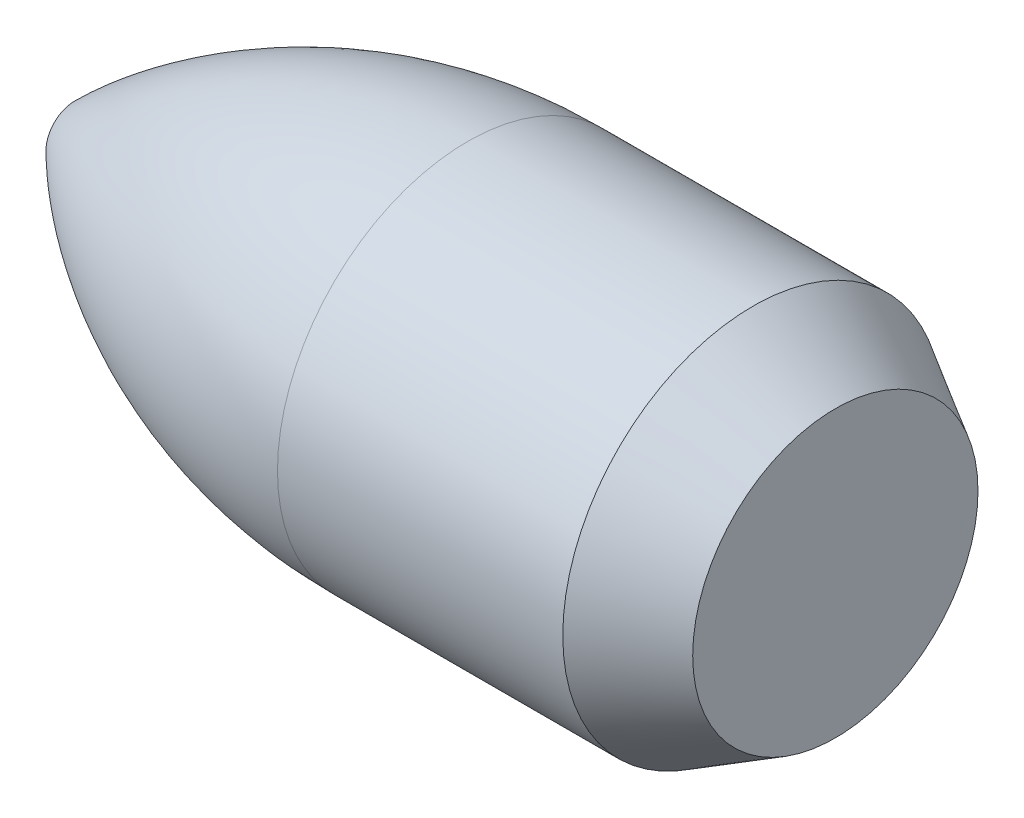
ISO-10303-21;
HEADER;
FILE_DESCRIPTION(('STEP AP214'),'2;1');
FILE_NAME('part.step','',(''),(''),'','','');
FILE_SCHEMA(('AUTOMOTIVE_DESIGN { 1 0 10303 214 1 1 1 1 }'));
ENDSEC;
DATA;
#1=APPLICATION_CONTEXT('core data for automotive mechanical design processes');
#2=APPLICATION_PROTOCOL_DEFINITION('international standard','automotive_design',2000,#1);
#3=PRODUCT_CONTEXT('',#1,'mechanical');
#4=PRODUCT('Part','Part','',(#3));
#5=PRODUCT_RELATED_PRODUCT_CATEGORY('part','',(#4));
#6=PRODUCT_DEFINITION_FORMATION('','',#4);
#7=PRODUCT_DEFINITION_CONTEXT('part definition',#1,'design');
#8=PRODUCT_DEFINITION('design','',#6,#7);
#9=PRODUCT_DEFINITION_SHAPE('','',#8);
#10=(LENGTH_UNIT() NAMED_UNIT(*) SI_UNIT(.MILLI.,.METRE.));
#11=(NAMED_UNIT(*) PLANE_ANGLE_UNIT() SI_UNIT($,.RADIAN.));
#12=(NAMED_UNIT(*) SI_UNIT($,.STERADIAN.) SOLID_ANGLE_UNIT());
#13=UNCERTAINTY_MEASURE_WITH_UNIT(LENGTH_MEASURE(1.E-05),#10,'distance_accuracy_value','');
#14=(GEOMETRIC_REPRESENTATION_CONTEXT(3) GLOBAL_UNCERTAINTY_ASSIGNED_CONTEXT((#13)) GLOBAL_UNIT_ASSIGNED_CONTEXT((#10,
#11,#12)) REPRESENTATION_CONTEXT('',''));
#15=CARTESIAN_POINT('',(0.,0.,0.));
#16=DIRECTION('',(0.,0.,1.));
#17=DIRECTION('',(1.,0.,0.));
#18=AXIS2_PLACEMENT_3D('',#15,#16,#17);
#19=CARTESIAN_POINT('',(40.,7.5,0.));
#20=DIRECTION('',(-1.,0.,0.));
#21=DIRECTION('',(0.,0.,1.));
#22=AXIS2_PLACEMENT_3D('',#19,#20,#21);
#23=PLANE('',#22);
#24=CARTESIAN_POINT('',(40.,0.,0.));
#25=DIRECTION('',(-1.,0.,0.));
#26=DIRECTION('',(0.,0.,1.));
#27=AXIS2_PLACEMENT_3D('',#24,#25,#26);
#28=CIRCLE('',#27,7.5);
#29=CARTESIAN_POINT('',(40.,0.,7.5));
#30=VERTEX_POINT('',#29);
#31=EDGE_CURVE('E10',#30,#30,#28,.T.);
#32=ORIENTED_EDGE('',*,*,#31,.F.);
#33=EDGE_LOOP('',(#32));
#34=FACE_BOUND('',#33,.T.);
#35=ADVANCED_FACE('F31',(#34),#23,.F.);
#36=CARTESIAN_POINT('',(40.,0.,0.));
#37=DIRECTION('',(-1.,0.,0.));
#38=DIRECTION('',(0.,0.,1.));
#39=AXIS2_PLACEMENT_3D('',#36,#37,#38);
#40=CONICAL_SURFACE('',#39,7.5,0.523598775598294);
#41=CARTESIAN_POINT('',(35.6698729810778,0.,0.));
#42=DIRECTION('',(-1.,0.,0.));
#43=DIRECTION('',(0.,0.,1.));
#44=AXIS2_PLACEMENT_3D('',#41,#42,#43);
#45=CIRCLE('',#44,10.);
#46=CARTESIAN_POINT('',(35.6698729810778,0.,10.));
#47=VERTEX_POINT('',#46);
#48=EDGE_CURVE('E37',#47,#47,#45,.T.);
#49=ORIENTED_EDGE('',*,*,#48,.F.);
#50=EDGE_LOOP('',(#49));
#51=FACE_BOUND('',#50,.T.);
#52=ORIENTED_EDGE('',*,*,#31,.T.);
#53=EDGE_LOOP('',(#52));
#54=FACE_BOUND('',#53,.T.);
#55=ADVANCED_FACE('F65',(#51,#54),#40,.T.);
#56=CARTESIAN_POINT('',(-8.0419042341372,0.,0.));
#57=DIRECTION('',(-1.,0.,0.));
#58=DIRECTION('',(0.,0.,1.));
#59=AXIS2_PLACEMENT_3D('',#56,#57,#58);
#60=CYLINDRICAL_SURFACE('',#59,10.);
#61=CARTESIAN_POINT('',(20.6698729810778,0.,0.));
#62=DIRECTION('',(-1.,0.,0.));
#63=DIRECTION('',(0.,0.,1.));
#64=AXIS2_PLACEMENT_3D('',#61,#62,#63);
#65=CIRCLE('',#64,10.);
#66=CARTESIAN_POINT('',(20.6698729810778,0.,10.));
#67=VERTEX_POINT('',#66);
#68=EDGE_CURVE('E41',#67,#67,#65,.T.);
#69=ORIENTED_EDGE('',*,*,#68,.F.);
#70=EDGE_LOOP('',(#69));
#71=FACE_BOUND('',#70,.T.);
#72=ORIENTED_EDGE('',*,*,#48,.T.);
#73=EDGE_LOOP('',(#72));
#74=FACE_BOUND('',#73,.T.);
#75=ADVANCED_FACE('F62',(#71,#74),#60,.T.);
#76=CARTESIAN_POINT('',(20.6698729810778,10.,0.));
#77=CARTESIAN_POINT('',(11.1421058110331,10.,0.));
#78=CARTESIAN_POINT('',(3.94892725872616,5.44892725872618,0.));
#79=CARTESIAN_POINT('',(0.,1.5,0.));
#80=B_SPLINE_CURVE_WITH_KNOTS('',3,(#76,#77,#78,#79),.UNSPECIFIED.,.F.,.F.,(4,4),(0.,1.),.UNSPECIFIED.);
#81=CARTESIAN_POINT('',(-8.0419042341372,0.,0.));
#82=DIRECTION('',(-1.,0.,0.));
#83=AXIS1_PLACEMENT('',#81,#82);
#84=SURFACE_OF_REVOLUTION('',#80,#83);
#85=CARTESIAN_POINT('',(0.,0.,0.));
#86=DIRECTION('',(-1.,0.,0.));
#87=DIRECTION('',(0.,0.,1.));
#88=AXIS2_PLACEMENT_3D('',#85,#86,#87);
#89=CIRCLE('',#88,1.5);
#90=CARTESIAN_POINT('',(0.,0.,1.5));
#91=VERTEX_POINT('',#90);
#92=EDGE_CURVE('E45',#91,#91,#89,.T.);
#93=ORIENTED_EDGE('',*,*,#92,.F.);
#94=EDGE_LOOP('',(#93));
#95=FACE_BOUND('',#94,.T.);
#96=ORIENTED_EDGE('',*,*,#68,.T.);
#97=EDGE_LOOP('',(#96));
#98=FACE_BOUND('',#97,.T.);
#99=ADVANCED_FACE('F57',(#95,#98),#84,.T.);
#100=CARTESIAN_POINT('',(0.,0.,0.));
#101=DIRECTION('',(1.,0.,0.));
#102=DIRECTION('',(0.,0.,-1.));
#103=AXIS2_PLACEMENT_3D('',#100,#101,#102);
#104=PLANE('',#103);
#105=ORIENTED_EDGE('',*,*,#92,.T.);
#106=EDGE_LOOP('',(#105));
#107=FACE_BOUND('',#106,.T.);
#108=ADVANCED_FACE('F61',(#107),#104,.F.);
#109=CLOSED_SHELL('',(#35,#55,#75,#99,#108));
#110=MANIFOLD_SOLID_BREP('B2',#109);
#111=ADVANCED_BREP_SHAPE_REPRESENTATION('',(#18,#110),#14);
#112=SHAPE_DEFINITION_REPRESENTATION(#9,#111);
ENDSEC;
END-ISO-10303-21;
